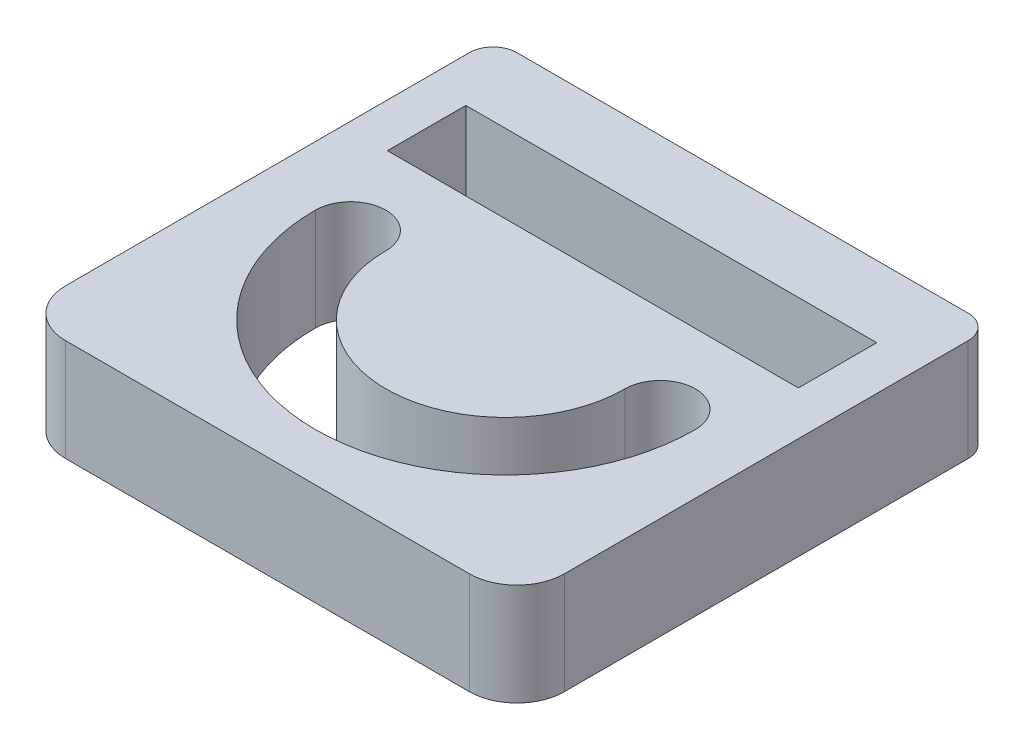
ISO-10303-21;
HEADER;
FILE_DESCRIPTION(('STEP AP214'),'2;1');
FILE_NAME('part.step','',(''),(''),'','','');
FILE_SCHEMA(('AUTOMOTIVE_DESIGN { 1 0 10303 214 1 1 1 1 }'));
ENDSEC;
DATA;
#1=APPLICATION_CONTEXT('core data for automotive mechanical design processes');
#2=APPLICATION_PROTOCOL_DEFINITION('international standard','automotive_design',2000,#1);
#3=PRODUCT_CONTEXT('',#1,'mechanical');
#4=PRODUCT('Part','Part','',(#3));
#5=PRODUCT_RELATED_PRODUCT_CATEGORY('part','',(#4));
#6=PRODUCT_DEFINITION_FORMATION('','',#4);
#7=PRODUCT_DEFINITION_CONTEXT('part definition',#1,'design');
#8=PRODUCT_DEFINITION('design','',#6,#7);
#9=PRODUCT_DEFINITION_SHAPE('','',#8);
#10=(LENGTH_UNIT() NAMED_UNIT(*) SI_UNIT(.MILLI.,.METRE.));
#11=(NAMED_UNIT(*) PLANE_ANGLE_UNIT() SI_UNIT($,.RADIAN.));
#12=(NAMED_UNIT(*) SI_UNIT($,.STERADIAN.) SOLID_ANGLE_UNIT());
#13=UNCERTAINTY_MEASURE_WITH_UNIT(LENGTH_MEASURE(1.E-05),#10,'distance_accuracy_value','');
#14=(GEOMETRIC_REPRESENTATION_CONTEXT(3) GLOBAL_UNCERTAINTY_ASSIGNED_CONTEXT((#13)) GLOBAL_UNIT_ASSIGNED_CONTEXT((#10,
#11,#12)) REPRESENTATION_CONTEXT('',''));
#15=CARTESIAN_POINT('',(0.,0.,0.));
#16=DIRECTION('',(0.,0.,1.));
#17=DIRECTION('',(1.,0.,0.));
#18=AXIS2_PLACEMENT_3D('',#15,#16,#17);
#19=CARTESIAN_POINT('',(8.5,4.3,8.));
#20=DIRECTION('',(0.,-1.,0.));
#21=DIRECTION('',(0.,0.,-1.));
#22=AXIS2_PLACEMENT_3D('',#19,#20,#21);
#23=CYLINDRICAL_SURFACE('',#22,2.);
#24=DIRECTION('',(0.,-1.,0.));
#25=VECTOR('',#24,1.);
#26=CARTESIAN_POINT('',(10.5,4.3,8.));
#27=LINE('',#26,#25);
#28=CARTESIAN_POINT('',(10.5,4.3,8.));
#29=VERTEX_POINT('',#28);
#30=CARTESIAN_POINT('',(10.5,0.,8.));
#31=VERTEX_POINT('',#30);
#32=EDGE_CURVE('E264',#29,#31,#27,.T.);
#33=ORIENTED_EDGE('',*,*,#32,.F.);
#34=CARTESIAN_POINT('',(8.5,4.3,8.));
#35=DIRECTION('',(0.,-1.,0.));
#36=DIRECTION('',(0.,0.,-1.));
#37=AXIS2_PLACEMENT_3D('',#34,#35,#36);
#38=CIRCLE('',#37,2.);
#39=CARTESIAN_POINT('',(8.49999999999999,4.3,10.));
#40=VERTEX_POINT('',#39);
#41=EDGE_CURVE('E40',#40,#29,#38,.F.);
#42=ORIENTED_EDGE('',*,*,#41,.F.);
#43=DIRECTION('',(0.,-1.,0.));
#44=VECTOR('',#43,1.);
#45=CARTESIAN_POINT('',(8.50000000000001,4.3,10.));
#46=LINE('',#45,#44);
#47=CARTESIAN_POINT('',(8.49999999999999,0.,10.));
#48=VERTEX_POINT('',#47);
#49=EDGE_CURVE('E267',#48,#40,#46,.F.);
#50=ORIENTED_EDGE('',*,*,#49,.F.);
#51=CARTESIAN_POINT('',(8.5,0.,8.));
#52=DIRECTION('',(0.,-1.,0.));
#53=DIRECTION('',(0.,0.,-1.));
#54=AXIS2_PLACEMENT_3D('',#51,#52,#53);
#55=CIRCLE('',#54,2.);
#56=EDGE_CURVE('E11',#31,#48,#55,.T.);
#57=ORIENTED_EDGE('',*,*,#56,.F.);
#58=EDGE_LOOP('',(#33,#42,#50,#57));
#59=FACE_BOUND('',#58,.T.);
#60=ADVANCED_FACE('F33',(#59),#23,.T.);
#61=CARTESIAN_POINT('',(-8.5,4.3,8.));
#62=DIRECTION('',(0.,1.,0.));
#63=DIRECTION('',(0.,0.,1.));
#64=AXIS2_PLACEMENT_3D('',#61,#62,#63);
#65=CYLINDRICAL_SURFACE('',#64,2.);
#66=DIRECTION('',(0.,1.,0.));
#67=VECTOR('',#66,1.);
#68=CARTESIAN_POINT('',(-10.5,4.3,8.));
#69=LINE('',#68,#67);
#70=CARTESIAN_POINT('',(-10.5,0.,8.));
#71=VERTEX_POINT('',#70);
#72=CARTESIAN_POINT('',(-10.5,4.3,8.));
#73=VERTEX_POINT('',#72);
#74=EDGE_CURVE('E254',#71,#73,#69,.T.);
#75=ORIENTED_EDGE('',*,*,#74,.F.);
#76=CARTESIAN_POINT('',(-8.5,0.,8.));
#77=DIRECTION('',(0.,-1.,0.));
#78=DIRECTION('',(0.,0.,-1.));
#79=AXIS2_PLACEMENT_3D('',#76,#77,#78);
#80=CIRCLE('',#79,2.);
#81=CARTESIAN_POINT('',(-8.5,0.,10.));
#82=VERTEX_POINT('',#81);
#83=EDGE_CURVE('E260',#82,#71,#80,.T.);
#84=ORIENTED_EDGE('',*,*,#83,.F.);
#85=DIRECTION('',(0.,1.,0.));
#86=VECTOR('',#85,1.);
#87=CARTESIAN_POINT('',(-8.5,4.3,10.));
#88=LINE('',#87,#86);
#89=CARTESIAN_POINT('',(-8.5,4.3,10.));
#90=VERTEX_POINT('',#89);
#91=EDGE_CURVE('E257',#90,#82,#88,.F.);
#92=ORIENTED_EDGE('',*,*,#91,.F.);
#93=CARTESIAN_POINT('',(-8.5,4.3,8.));
#94=DIRECTION('',(0.,-1.,0.));
#95=DIRECTION('',(0.,0.,-1.));
#96=AXIS2_PLACEMENT_3D('',#93,#94,#95);
#97=CIRCLE('',#96,2.);
#98=EDGE_CURVE('E262',#73,#90,#97,.F.);
#99=ORIENTED_EDGE('',*,*,#98,.F.);
#100=EDGE_LOOP('',(#75,#84,#92,#99));
#101=FACE_BOUND('',#100,.T.);
#102=ADVANCED_FACE('F300',(#101),#65,.T.);
#103=CARTESIAN_POINT('',(-9.5,4.3,-9.));
#104=DIRECTION('',(0.,1.,0.));
#105=DIRECTION('',(0.,0.,1.));
#106=AXIS2_PLACEMENT_3D('',#103,#104,#105);
#107=CYLINDRICAL_SURFACE('',#106,1.);
#108=DIRECTION('',(0.,1.,0.));
#109=VECTOR('',#108,1.);
#110=CARTESIAN_POINT('',(-9.5,4.3,-10.));
#111=LINE('',#110,#109);
#112=CARTESIAN_POINT('',(-9.5,0.,-10.));
#113=VERTEX_POINT('',#112);
#114=CARTESIAN_POINT('',(-9.5,4.3,-10.));
#115=VERTEX_POINT('',#114);
#116=EDGE_CURVE('E244',#113,#115,#111,.T.);
#117=ORIENTED_EDGE('',*,*,#116,.F.);
#118=CARTESIAN_POINT('',(-9.5,0.,-9.));
#119=DIRECTION('',(0.,-1.,0.));
#120=DIRECTION('',(0.,0.,-1.));
#121=AXIS2_PLACEMENT_3D('',#118,#119,#120);
#122=CIRCLE('',#121,1.);
#123=CARTESIAN_POINT('',(-10.5,0.,-9.));
#124=VERTEX_POINT('',#123);
#125=EDGE_CURVE('E250',#124,#113,#122,.T.);
#126=ORIENTED_EDGE('',*,*,#125,.F.);
#127=DIRECTION('',(0.,1.,0.));
#128=VECTOR('',#127,1.);
#129=CARTESIAN_POINT('',(-10.5,4.3,-9.));
#130=LINE('',#129,#128);
#131=CARTESIAN_POINT('',(-10.5,4.3,-9.));
#132=VERTEX_POINT('',#131);
#133=EDGE_CURVE('E247',#132,#124,#130,.F.);
#134=ORIENTED_EDGE('',*,*,#133,.F.);
#135=CARTESIAN_POINT('',(-9.5,4.3,-9.));
#136=DIRECTION('',(0.,-1.,0.));
#137=DIRECTION('',(0.,0.,-1.));
#138=AXIS2_PLACEMENT_3D('',#135,#136,#137);
#139=CIRCLE('',#138,1.);
#140=EDGE_CURVE('E252',#115,#132,#139,.F.);
#141=ORIENTED_EDGE('',*,*,#140,.F.);
#142=EDGE_LOOP('',(#117,#126,#134,#141));
#143=FACE_BOUND('',#142,.T.);
#144=ADVANCED_FACE('F292',(#143),#107,.T.);
#145=CARTESIAN_POINT('',(9.50000000000001,4.3,-9.));
#146=DIRECTION('',(0.,1.,0.));
#147=DIRECTION('',(0.,0.,1.));
#148=AXIS2_PLACEMENT_3D('',#145,#146,#147);
#149=CYLINDRICAL_SURFACE('',#148,1.);
#150=DIRECTION('',(0.,1.,0.));
#151=VECTOR('',#150,1.);
#152=CARTESIAN_POINT('',(10.5,4.3,-9.));
#153=LINE('',#152,#151);
#154=CARTESIAN_POINT('',(10.5,0.,-9.));
#155=VERTEX_POINT('',#154);
#156=CARTESIAN_POINT('',(10.5,4.3,-9.));
#157=VERTEX_POINT('',#156);
#158=EDGE_CURVE('E224',#155,#157,#153,.T.);
#159=ORIENTED_EDGE('',*,*,#158,.F.);
#160=CARTESIAN_POINT('',(9.50000000000001,0.,-9.));
#161=DIRECTION('',(0.,-1.,0.));
#162=DIRECTION('',(0.,0.,-1.));
#163=AXIS2_PLACEMENT_3D('',#160,#161,#162);
#164=CIRCLE('',#163,1.);
#165=CARTESIAN_POINT('',(9.5,0.,-10.));
#166=VERTEX_POINT('',#165);
#167=EDGE_CURVE('E239',#166,#155,#164,.T.);
#168=ORIENTED_EDGE('',*,*,#167,.F.);
#169=DIRECTION('',(0.,1.,0.));
#170=VECTOR('',#169,1.);
#171=CARTESIAN_POINT('',(9.50000000000001,4.3,-10.));
#172=LINE('',#171,#170);
#173=CARTESIAN_POINT('',(9.5,4.3,-10.));
#174=VERTEX_POINT('',#173);
#175=EDGE_CURVE('E236',#174,#166,#172,.F.);
#176=ORIENTED_EDGE('',*,*,#175,.F.);
#177=CARTESIAN_POINT('',(9.50000000000001,4.3,-9.));
#178=DIRECTION('',(0.,-1.,0.));
#179=DIRECTION('',(0.,0.,-1.));
#180=AXIS2_PLACEMENT_3D('',#177,#178,#179);
#181=CIRCLE('',#180,1.);
#182=EDGE_CURVE('E242',#157,#174,#181,.F.);
#183=ORIENTED_EDGE('',*,*,#182,.F.);
#184=EDGE_LOOP('',(#159,#168,#176,#183));
#185=FACE_BOUND('',#184,.T.);
#186=ADVANCED_FACE('F283',(#185),#149,.T.);
#187=CARTESIAN_POINT('',(0.,4.3,0.));
#188=DIRECTION('',(0.,-1.,0.));
#189=DIRECTION('',(0.,0.,-1.));
#190=AXIS2_PLACEMENT_3D('',#187,#188,#189);
#191=PLANE('',#190);
#192=CARTESIAN_POINT('',(0.,4.3,-0.0162692215186838));
#193=DIRECTION('',(0.,1.,0.));
#194=DIRECTION('',(0.,0.,1.));
#195=AXIS2_PLACEMENT_3D('',#192,#193,#194);
#196=CIRCLE('',#195,8.);
#197=CARTESIAN_POINT('',(-8.00000000000001,4.3,-0.0162692215186853));
#198=VERTEX_POINT('',#197);
#199=CARTESIAN_POINT('',(7.99999999999999,4.3,-0.0162692215186833));
#200=VERTEX_POINT('',#199);
#201=EDGE_CURVE('E171',#198,#200,#196,.T.);
#202=ORIENTED_EDGE('',*,*,#201,.F.);
#203=CARTESIAN_POINT('',(-6.51626922151869,4.3,-0.0162692215186838));
#204=DIRECTION('',(0.,1.,0.));
#205=DIRECTION('',(0.,0.,1.));
#206=AXIS2_PLACEMENT_3D('',#203,#204,#205);
#207=CIRCLE('',#206,1.48373077848132);
#208=CARTESIAN_POINT('',(-5.03253844303738,4.3,-0.0162692215186847));
#209=VERTEX_POINT('',#208);
#210=EDGE_CURVE('E47',#209,#198,#207,.T.);
#211=ORIENTED_EDGE('',*,*,#210,.F.);
#212=CARTESIAN_POINT('',(0.,4.3,-0.0162692215186838));
#213=DIRECTION('',(0.,-1.,0.));
#214=DIRECTION('',(0.,0.,1.));
#215=AXIS2_PLACEMENT_3D('',#212,#213,#214);
#216=CIRCLE('',#215,5.03253844303737);
#217=CARTESIAN_POINT('',(5.03253844303736,4.3,-0.0162692215186852));
#218=VERTEX_POINT('',#217);
#219=EDGE_CURVE('E162',#218,#209,#216,.T.);
#220=ORIENTED_EDGE('',*,*,#219,.F.);
#221=CARTESIAN_POINT('',(6.51626922151867,4.3,-0.016269221518685));
#222=DIRECTION('',(0.,1.,0.));
#223=DIRECTION('',(0.,0.,1.));
#224=AXIS2_PLACEMENT_3D('',#221,#222,#223);
#225=CIRCLE('',#224,1.48373077848132);
#226=EDGE_CURVE('E165',#200,#218,#225,.T.);
#227=ORIENTED_EDGE('',*,*,#226,.F.);
#228=EDGE_LOOP('',(#202,#211,#220,#227));
#229=FACE_BOUND('',#228,.T.);
#230=DIRECTION('',(1.,0.,0.));
#231=VECTOR('',#230,1.);
#232=CARTESIAN_POINT('',(-10.5,4.3,10.));
#233=LINE('',#232,#231);
#234=EDGE_CURVE('E221',#90,#40,#233,.T.);
#235=ORIENTED_EDGE('',*,*,#234,.T.);
#236=ORIENTED_EDGE('',*,*,#41,.T.);
#237=DIRECTION('',(0.,0.,-1.));
#238=VECTOR('',#237,1.);
#239=CARTESIAN_POINT('',(10.5,4.3,10.));
#240=LINE('',#239,#238);
#241=EDGE_CURVE('E212',#29,#157,#240,.T.);
#242=ORIENTED_EDGE('',*,*,#241,.T.);
#243=ORIENTED_EDGE('',*,*,#182,.T.);
#244=DIRECTION('',(-1.,0.,0.));
#245=VECTOR('',#244,1.);
#246=CARTESIAN_POINT('',(-10.5,4.3,-10.));
#247=LINE('',#246,#245);
#248=EDGE_CURVE('E214',#174,#115,#247,.T.);
#249=ORIENTED_EDGE('',*,*,#248,.T.);
#250=ORIENTED_EDGE('',*,*,#140,.T.);
#251=DIRECTION('',(0.,0.,1.));
#252=VECTOR('',#251,1.);
#253=CARTESIAN_POINT('',(-10.5,4.3,10.));
#254=LINE('',#253,#252);
#255=EDGE_CURVE('E218',#132,#73,#254,.T.);
#256=ORIENTED_EDGE('',*,*,#255,.T.);
#257=ORIENTED_EDGE('',*,*,#98,.T.);
#258=EDGE_LOOP('',(#235,#236,#242,#243,#249,#250,#256,#257));
#259=FACE_BOUND('',#258,.T.);
#260=DIRECTION('',(0.,0.,-1.));
#261=VECTOR('',#260,1.);
#262=CARTESIAN_POINT('',(8.65000000000001,4.3,-7.));
#263=LINE('',#262,#261);
#264=CARTESIAN_POINT('',(8.65000000000001,4.3,-3.7));
#265=VERTEX_POINT('',#264);
#266=CARTESIAN_POINT('',(8.65000000000001,4.3,-7.));
#267=VERTEX_POINT('',#266);
#268=EDGE_CURVE('E181',#265,#267,#263,.T.);
#269=ORIENTED_EDGE('',*,*,#268,.F.);
#270=DIRECTION('',(1.,0.,0.));
#271=VECTOR('',#270,1.);
#272=CARTESIAN_POINT('',(-8.65,4.3,-3.7));
#273=LINE('',#272,#271);
#274=CARTESIAN_POINT('',(-8.65,4.3,-3.7));
#275=VERTEX_POINT('',#274);
#276=EDGE_CURVE('E189',#275,#265,#273,.T.);
#277=ORIENTED_EDGE('',*,*,#276,.F.);
#278=DIRECTION('',(0.,0.,1.));
#279=VECTOR('',#278,1.);
#280=CARTESIAN_POINT('',(-8.65,4.3,-7.));
#281=LINE('',#280,#279);
#282=CARTESIAN_POINT('',(-8.65,4.3,-7.));
#283=VERTEX_POINT('',#282);
#284=EDGE_CURVE('E186',#283,#275,#281,.T.);
#285=ORIENTED_EDGE('',*,*,#284,.F.);
#286=DIRECTION('',(-1.,0.,0.));
#287=VECTOR('',#286,1.);
#288=CARTESIAN_POINT('',(-8.65,4.3,-7.));
#289=LINE('',#288,#287);
#290=EDGE_CURVE('E183',#267,#283,#289,.T.);
#291=ORIENTED_EDGE('',*,*,#290,.F.);
#292=EDGE_LOOP('',(#269,#277,#285,#291));
#293=FACE_BOUND('',#292,.T.);
#294=ADVANCED_FACE('F271',(#229,#259,#293),#191,.F.);
#295=CARTESIAN_POINT('',(0.,0.,0.));
#296=DIRECTION('',(0.,-1.,0.));
#297=DIRECTION('',(0.,0.,-1.));
#298=AXIS2_PLACEMENT_3D('',#295,#296,#297);
#299=PLANE('',#298);
#300=CARTESIAN_POINT('',(-6.51626922151869,0.,-0.0162692215186838));
#301=DIRECTION('',(0.,1.,0.));
#302=DIRECTION('',(0.,0.,1.));
#303=AXIS2_PLACEMENT_3D('',#300,#301,#302);
#304=CIRCLE('',#303,1.48373077848132);
#305=CARTESIAN_POINT('',(-5.03253844303738,0.,-0.0162692215186847));
#306=VERTEX_POINT('',#305);
#307=CARTESIAN_POINT('',(-8.00000000000001,0.,-0.0162692215186853));
#308=VERTEX_POINT('',#307);
#309=EDGE_CURVE('E146',#306,#308,#304,.T.);
#310=ORIENTED_EDGE('',*,*,#309,.T.);
#311=CARTESIAN_POINT('',(0.,0.,-0.0162692215186838));
#312=DIRECTION('',(0.,1.,0.));
#313=DIRECTION('',(0.,0.,1.));
#314=AXIS2_PLACEMENT_3D('',#311,#312,#313);
#315=CIRCLE('',#314,8.);
#316=CARTESIAN_POINT('',(7.99999999999999,0.,-0.0162692215186833));
#317=VERTEX_POINT('',#316);
#318=EDGE_CURVE('E155',#308,#317,#315,.T.);
#319=ORIENTED_EDGE('',*,*,#318,.T.);
#320=CARTESIAN_POINT('',(6.51626922151867,0.,-0.016269221518685));
#321=DIRECTION('',(0.,1.,0.));
#322=DIRECTION('',(0.,0.,1.));
#323=AXIS2_PLACEMENT_3D('',#320,#321,#322);
#324=CIRCLE('',#323,1.48373077848132);
#325=CARTESIAN_POINT('',(5.03253844303736,0.,-0.0162692215186852));
#326=VERTEX_POINT('',#325);
#327=EDGE_CURVE('E55',#317,#326,#324,.T.);
#328=ORIENTED_EDGE('',*,*,#327,.T.);
#329=CARTESIAN_POINT('',(0.,0.,-0.0162692215186838));
#330=DIRECTION('',(0.,-1.,0.));
#331=DIRECTION('',(0.,0.,1.));
#332=AXIS2_PLACEMENT_3D('',#329,#330,#331);
#333=CIRCLE('',#332,5.03253844303737);
#334=EDGE_CURVE('E152',#326,#306,#333,.T.);
#335=ORIENTED_EDGE('',*,*,#334,.T.);
#336=EDGE_LOOP('',(#310,#319,#328,#335));
#337=FACE_BOUND('',#336,.T.);
#338=DIRECTION('',(0.,0.,-1.));
#339=VECTOR('',#338,1.);
#340=CARTESIAN_POINT('',(10.5,0.,10.));
#341=LINE('',#340,#339);
#342=EDGE_CURVE('E211',#31,#155,#341,.T.);
#343=ORIENTED_EDGE('',*,*,#342,.F.);
#344=ORIENTED_EDGE('',*,*,#56,.T.);
#345=DIRECTION('',(1.,0.,0.));
#346=VECTOR('',#345,1.);
#347=CARTESIAN_POINT('',(-10.5,0.,10.));
#348=LINE('',#347,#346);
#349=EDGE_CURVE('E215',#82,#48,#348,.T.);
#350=ORIENTED_EDGE('',*,*,#349,.F.);
#351=ORIENTED_EDGE('',*,*,#83,.T.);
#352=DIRECTION('',(0.,0.,1.));
#353=VECTOR('',#352,1.);
#354=CARTESIAN_POINT('',(-10.5,0.,10.));
#355=LINE('',#354,#353);
#356=EDGE_CURVE('E229',#124,#71,#355,.T.);
#357=ORIENTED_EDGE('',*,*,#356,.F.);
#358=ORIENTED_EDGE('',*,*,#125,.T.);
#359=DIRECTION('',(-1.,0.,0.));
#360=VECTOR('',#359,1.);
#361=CARTESIAN_POINT('',(-10.5,0.,-10.));
#362=LINE('',#361,#360);
#363=EDGE_CURVE('E226',#166,#113,#362,.T.);
#364=ORIENTED_EDGE('',*,*,#363,.F.);
#365=ORIENTED_EDGE('',*,*,#167,.T.);
#366=EDGE_LOOP('',(#343,#344,#350,#351,#357,#358,#364,#365));
#367=FACE_BOUND('',#366,.T.);
#368=DIRECTION('',(1.,0.,0.));
#369=VECTOR('',#368,1.);
#370=CARTESIAN_POINT('',(-8.65,0.,-3.7));
#371=LINE('',#370,#369);
#372=CARTESIAN_POINT('',(-8.65,0.,-3.7));
#373=VERTEX_POINT('',#372);
#374=CARTESIAN_POINT('',(8.65000000000001,0.,-3.7));
#375=VERTEX_POINT('',#374);
#376=EDGE_CURVE('E184',#373,#375,#371,.T.);
#377=ORIENTED_EDGE('',*,*,#376,.T.);
#378=DIRECTION('',(0.,0.,-1.));
#379=VECTOR('',#378,1.);
#380=CARTESIAN_POINT('',(8.65000000000001,0.,-7.));
#381=LINE('',#380,#379);
#382=CARTESIAN_POINT('',(8.65000000000001,0.,-7.));
#383=VERTEX_POINT('',#382);
#384=EDGE_CURVE('E177',#375,#383,#381,.T.);
#385=ORIENTED_EDGE('',*,*,#384,.T.);
#386=DIRECTION('',(-1.,0.,0.));
#387=VECTOR('',#386,1.);
#388=CARTESIAN_POINT('',(-8.65,0.,-7.));
#389=LINE('',#388,#387);
#390=CARTESIAN_POINT('',(-8.65,0.,-7.));
#391=VERTEX_POINT('',#390);
#392=EDGE_CURVE('E194',#383,#391,#389,.T.);
#393=ORIENTED_EDGE('',*,*,#392,.T.);
#394=DIRECTION('',(0.,0.,1.));
#395=VECTOR('',#394,1.);
#396=CARTESIAN_POINT('',(-8.65,0.,-7.));
#397=LINE('',#396,#395);
#398=EDGE_CURVE('E197',#391,#373,#397,.T.);
#399=ORIENTED_EDGE('',*,*,#398,.T.);
#400=EDGE_LOOP('',(#377,#385,#393,#399));
#401=FACE_BOUND('',#400,.T.);
#402=ADVANCED_FACE('F159',(#337,#367,#401),#299,.T.);
#403=CARTESIAN_POINT('',(10.5,4.3,10.));
#404=DIRECTION('',(-1.,0.,0.));
#405=DIRECTION('',(0.,0.,1.));
#406=AXIS2_PLACEMENT_3D('',#403,#404,#405);
#407=PLANE('',#406);
#408=ORIENTED_EDGE('',*,*,#241,.F.);
#409=ORIENTED_EDGE('',*,*,#32,.T.);
#410=ORIENTED_EDGE('',*,*,#342,.T.);
#411=ORIENTED_EDGE('',*,*,#158,.T.);
#412=EDGE_LOOP('',(#408,#409,#410,#411));
#413=FACE_BOUND('',#412,.T.);
#414=ADVANCED_FACE('F280',(#413),#407,.F.);
#415=CARTESIAN_POINT('',(-10.5,4.3,-10.));
#416=DIRECTION('',(0.,0.,1.));
#417=DIRECTION('',(1.,0.,0.));
#418=AXIS2_PLACEMENT_3D('',#415,#416,#417);
#419=PLANE('',#418);
#420=ORIENTED_EDGE('',*,*,#363,.T.);
#421=ORIENTED_EDGE('',*,*,#116,.T.);
#422=ORIENTED_EDGE('',*,*,#248,.F.);
#423=ORIENTED_EDGE('',*,*,#175,.T.);
#424=EDGE_LOOP('',(#420,#421,#422,#423));
#425=FACE_BOUND('',#424,.T.);
#426=ADVANCED_FACE('F288',(#425),#419,.F.);
#427=CARTESIAN_POINT('',(-10.5,4.3,10.));
#428=DIRECTION('',(1.,0.,0.));
#429=DIRECTION('',(0.,0.,-1.));
#430=AXIS2_PLACEMENT_3D('',#427,#428,#429);
#431=PLANE('',#430);
#432=ORIENTED_EDGE('',*,*,#356,.T.);
#433=ORIENTED_EDGE('',*,*,#74,.T.);
#434=ORIENTED_EDGE('',*,*,#255,.F.);
#435=ORIENTED_EDGE('',*,*,#133,.T.);
#436=EDGE_LOOP('',(#432,#433,#434,#435));
#437=FACE_BOUND('',#436,.T.);
#438=ADVANCED_FACE('F296',(#437),#431,.F.);
#439=CARTESIAN_POINT('',(-10.5,4.3,10.));
#440=DIRECTION('',(0.,0.,-1.));
#441=DIRECTION('',(-1.,0.,0.));
#442=AXIS2_PLACEMENT_3D('',#439,#440,#441);
#443=PLANE('',#442);
#444=ORIENTED_EDGE('',*,*,#349,.T.);
#445=ORIENTED_EDGE('',*,*,#49,.T.);
#446=ORIENTED_EDGE('',*,*,#234,.F.);
#447=ORIENTED_EDGE('',*,*,#91,.T.);
#448=EDGE_LOOP('',(#444,#445,#446,#447));
#449=FACE_BOUND('',#448,.T.);
#450=ADVANCED_FACE('F303',(#449),#443,.F.);
#451=CARTESIAN_POINT('',(8.65000000000001,4.3,-7.));
#452=DIRECTION('',(-1.,0.,0.));
#453=DIRECTION('',(0.,0.,1.));
#454=AXIS2_PLACEMENT_3D('',#451,#452,#453);
#455=PLANE('',#454);
#456=ORIENTED_EDGE('',*,*,#384,.F.);
#457=DIRECTION('',(0.,-1.,0.));
#458=VECTOR('',#457,1.);
#459=CARTESIAN_POINT('',(8.65000000000001,4.3,-3.7));
#460=LINE('',#459,#458);
#461=EDGE_CURVE('E191',#265,#375,#460,.T.);
#462=ORIENTED_EDGE('',*,*,#461,.F.);
#463=ORIENTED_EDGE('',*,*,#268,.T.);
#464=DIRECTION('',(0.,-1.,0.));
#465=VECTOR('',#464,1.);
#466=CARTESIAN_POINT('',(8.65000000000001,4.3,-7.));
#467=LINE('',#466,#465);
#468=EDGE_CURVE('E208',#267,#383,#467,.T.);
#469=ORIENTED_EDGE('',*,*,#468,.T.);
#470=EDGE_LOOP('',(#456,#462,#463,#469));
#471=FACE_BOUND('',#470,.T.);
#472=ADVANCED_FACE('F315',(#471),#455,.T.);
#473=CARTESIAN_POINT('',(-8.65,4.3,-7.));
#474=DIRECTION('',(0.,0.,1.));
#475=DIRECTION('',(1.,0.,0.));
#476=AXIS2_PLACEMENT_3D('',#473,#474,#475);
#477=PLANE('',#476);
#478=ORIENTED_EDGE('',*,*,#392,.F.);
#479=ORIENTED_EDGE('',*,*,#468,.F.);
#480=ORIENTED_EDGE('',*,*,#290,.T.);
#481=DIRECTION('',(0.,-1.,0.));
#482=VECTOR('',#481,1.);
#483=CARTESIAN_POINT('',(-8.65,4.3,-7.));
#484=LINE('',#483,#482);
#485=EDGE_CURVE('E206',#283,#391,#484,.T.);
#486=ORIENTED_EDGE('',*,*,#485,.T.);
#487=EDGE_LOOP('',(#478,#479,#480,#486));
#488=FACE_BOUND('',#487,.T.);
#489=ADVANCED_FACE('F321',(#488),#477,.T.);
#490=CARTESIAN_POINT('',(-8.65,4.3,-7.));
#491=DIRECTION('',(1.,0.,0.));
#492=DIRECTION('',(0.,0.,-1.));
#493=AXIS2_PLACEMENT_3D('',#490,#491,#492);
#494=PLANE('',#493);
#495=ORIENTED_EDGE('',*,*,#398,.F.);
#496=ORIENTED_EDGE('',*,*,#485,.F.);
#497=ORIENTED_EDGE('',*,*,#284,.T.);
#498=DIRECTION('',(0.,-1.,0.));
#499=VECTOR('',#498,1.);
#500=CARTESIAN_POINT('',(-8.65,4.3,-3.7));
#501=LINE('',#500,#499);
#502=EDGE_CURVE('E204',#275,#373,#501,.T.);
#503=ORIENTED_EDGE('',*,*,#502,.T.);
#504=EDGE_LOOP('',(#495,#496,#497,#503));
#505=FACE_BOUND('',#504,.T.);
#506=ADVANCED_FACE('F323',(#505),#494,.T.);
#507=CARTESIAN_POINT('',(-8.65,4.3,-3.7));
#508=DIRECTION('',(0.,0.,-1.));
#509=DIRECTION('',(-1.,0.,0.));
#510=AXIS2_PLACEMENT_3D('',#507,#508,#509);
#511=PLANE('',#510);
#512=ORIENTED_EDGE('',*,*,#376,.F.);
#513=ORIENTED_EDGE('',*,*,#502,.F.);
#514=ORIENTED_EDGE('',*,*,#276,.T.);
#515=ORIENTED_EDGE('',*,*,#461,.T.);
#516=EDGE_LOOP('',(#512,#513,#514,#515));
#517=FACE_BOUND('',#516,.T.);
#518=ADVANCED_FACE('F310',(#517),#511,.T.);
#519=CARTESIAN_POINT('',(-6.51626922151869,0.,-0.0162692215186838));
#520=DIRECTION('',(0.,1.,0.));
#521=DIRECTION('',(0.,0.,1.));
#522=AXIS2_PLACEMENT_3D('',#519,#520,#521);
#523=CYLINDRICAL_SURFACE('',#522,1.48373077848132);
#524=ORIENTED_EDGE('',*,*,#210,.T.);
#525=DIRECTION('',(0.,1.,0.));
#526=VECTOR('',#525,1.);
#527=CARTESIAN_POINT('',(-8.00000000000001,0.,-0.0162692215186853));
#528=LINE('',#527,#526);
#529=EDGE_CURVE('E142',#308,#198,#528,.T.);
#530=ORIENTED_EDGE('',*,*,#529,.F.);
#531=ORIENTED_EDGE('',*,*,#309,.F.);
#532=DIRECTION('',(0.,1.,0.));
#533=VECTOR('',#532,1.);
#534=CARTESIAN_POINT('',(-5.03253844303738,0.,-0.0162692215186847));
#535=LINE('',#534,#533);
#536=EDGE_CURVE('E175',#306,#209,#535,.T.);
#537=ORIENTED_EDGE('',*,*,#536,.T.);
#538=EDGE_LOOP('',(#524,#530,#531,#537));
#539=FACE_BOUND('',#538,.T.);
#540=ADVANCED_FACE('F144',(#539),#523,.F.);
#541=CARTESIAN_POINT('',(0.,0.,-0.0162692215186838));
#542=DIRECTION('',(0.,1.,0.));
#543=DIRECTION('',(0.,0.,1.));
#544=AXIS2_PLACEMENT_3D('',#541,#542,#543);
#545=CYLINDRICAL_SURFACE('',#544,5.03253844303737);
#546=ORIENTED_EDGE('',*,*,#219,.T.);
#547=ORIENTED_EDGE('',*,*,#536,.F.);
#548=ORIENTED_EDGE('',*,*,#334,.F.);
#549=DIRECTION('',(0.,1.,0.));
#550=VECTOR('',#549,1.);
#551=CARTESIAN_POINT('',(5.03253844303736,0.,-0.0162692215186852));
#552=LINE('',#551,#550);
#553=EDGE_CURVE('E178',#326,#218,#552,.T.);
#554=ORIENTED_EDGE('',*,*,#553,.T.);
#555=EDGE_LOOP('',(#546,#547,#548,#554));
#556=FACE_BOUND('',#555,.T.);
#557=ADVANCED_FACE('F436',(#556),#545,.T.);
#558=CARTESIAN_POINT('',(6.51626922151867,0.,-0.016269221518685));
#559=DIRECTION('',(0.,1.,0.));
#560=DIRECTION('',(0.,0.,1.));
#561=AXIS2_PLACEMENT_3D('',#558,#559,#560);
#562=CYLINDRICAL_SURFACE('',#561,1.48373077848132);
#563=ORIENTED_EDGE('',*,*,#226,.T.);
#564=ORIENTED_EDGE('',*,*,#553,.F.);
#565=ORIENTED_EDGE('',*,*,#327,.F.);
#566=DIRECTION('',(0.,1.,0.));
#567=VECTOR('',#566,1.);
#568=CARTESIAN_POINT('',(7.99999999999999,0.,-0.0162692215186833));
#569=LINE('',#568,#567);
#570=EDGE_CURVE('E151',#317,#200,#569,.T.);
#571=ORIENTED_EDGE('',*,*,#570,.T.);
#572=EDGE_LOOP('',(#563,#564,#565,#571));
#573=FACE_BOUND('',#572,.T.);
#574=ADVANCED_FACE('F445',(#573),#562,.F.);
#575=CARTESIAN_POINT('',(0.,0.,-0.0162692215186838));
#576=DIRECTION('',(0.,1.,0.));
#577=DIRECTION('',(0.,0.,1.));
#578=AXIS2_PLACEMENT_3D('',#575,#576,#577);
#579=CYLINDRICAL_SURFACE('',#578,8.);
#580=ORIENTED_EDGE('',*,*,#201,.T.);
#581=ORIENTED_EDGE('',*,*,#570,.F.);
#582=ORIENTED_EDGE('',*,*,#318,.F.);
#583=ORIENTED_EDGE('',*,*,#529,.T.);
#584=EDGE_LOOP('',(#580,#581,#582,#583));
#585=FACE_BOUND('',#584,.T.);
#586=ADVANCED_FACE('F156',(#585),#579,.F.);
#587=CLOSED_SHELL('',(#60,#102,#144,#186,#294,#402,#414,#426,#438,#450,#472,#489,#506,#518,#540,
#557,#574,#586));
#588=MANIFOLD_SOLID_BREP('B2',#587);
#589=ADVANCED_BREP_SHAPE_REPRESENTATION('',(#18,#588),#14);
#590=SHAPE_DEFINITION_REPRESENTATION(#9,#589);
ENDSEC;
END-ISO-10303-21;
